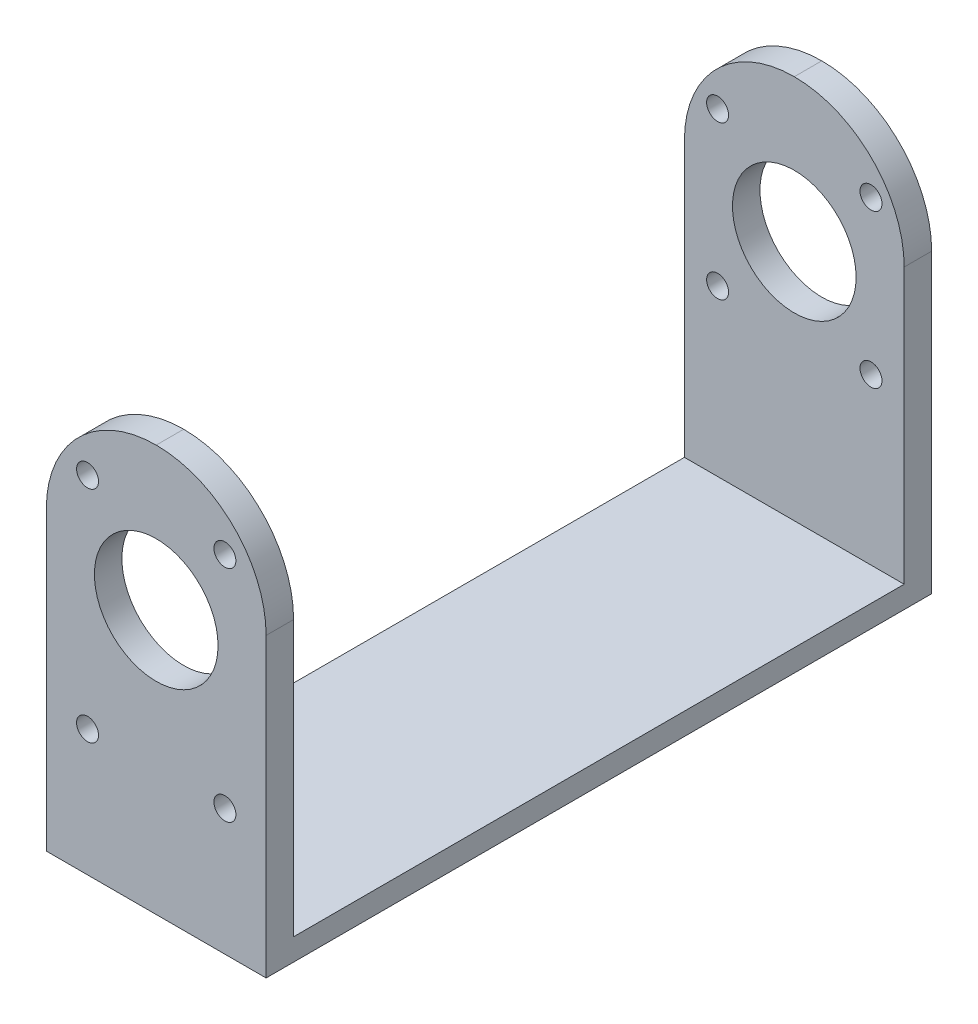
ISO-10303-21;
HEADER;
FILE_DESCRIPTION(('STEP AP214'),'2;1');
FILE_NAME('part.step','',(''),(''),'','','');
FILE_SCHEMA(('AUTOMOTIVE_DESIGN { 1 0 10303 214 1 1 1 1 }'));
ENDSEC;
DATA;
#1=APPLICATION_CONTEXT('core data for automotive mechanical design processes');
#2=APPLICATION_PROTOCOL_DEFINITION('international standard','automotive_design',2000,#1);
#3=PRODUCT_CONTEXT('',#1,'mechanical');
#4=PRODUCT('Part','Part','',(#3));
#5=PRODUCT_RELATED_PRODUCT_CATEGORY('part','',(#4));
#6=PRODUCT_DEFINITION_FORMATION('','',#4);
#7=PRODUCT_DEFINITION_CONTEXT('part definition',#1,'design');
#8=PRODUCT_DEFINITION('design','',#6,#7);
#9=PRODUCT_DEFINITION_SHAPE('','',#8);
#10=(LENGTH_UNIT() NAMED_UNIT(*) SI_UNIT(.MILLI.,.METRE.));
#11=(NAMED_UNIT(*) PLANE_ANGLE_UNIT() SI_UNIT($,.RADIAN.));
#12=(NAMED_UNIT(*) SI_UNIT($,.STERADIAN.) SOLID_ANGLE_UNIT());
#13=UNCERTAINTY_MEASURE_WITH_UNIT(LENGTH_MEASURE(1.E-05),#10,'distance_accuracy_value','');
#14=(GEOMETRIC_REPRESENTATION_CONTEXT(3) GLOBAL_UNCERTAINTY_ASSIGNED_CONTEXT((#13)) GLOBAL_UNIT_ASSIGNED_CONTEXT((#10,
#11,#12)) REPRESENTATION_CONTEXT('',''));
#15=CARTESIAN_POINT('',(0.,0.,0.));
#16=DIRECTION('',(0.,0.,1.));
#17=DIRECTION('',(1.,0.,0.));
#18=AXIS2_PLACEMENT_3D('',#15,#16,#17);
#19=CARTESIAN_POINT('',(0.,5.08,0.));
#20=DIRECTION('',(0.,1.,0.));
#21=DIRECTION('',(0.,0.,1.));
#22=AXIS2_PLACEMENT_3D('',#19,#20,#21);
#23=PLANE('',#22);
#24=DIRECTION('',(0.,0.,-1.));
#25=VECTOR('',#24,1.);
#26=CARTESIAN_POINT('',(0.,5.08,0.));
#27=LINE('',#26,#25);
#28=CARTESIAN_POINT('',(0.,5.08,-6.35));
#29=VERTEX_POINT('',#28);
#30=CARTESIAN_POINT('',(0.,5.08,-147.488618459224));
#31=VERTEX_POINT('',#30);
#32=EDGE_CURVE('E138',#29,#31,#27,.T.);
#33=ORIENTED_EDGE('',*,*,#32,.F.);
#34=DIRECTION('',(-1.,0.,0.));
#35=VECTOR('',#34,1.);
#36=CARTESIAN_POINT('',(0.,5.08,-6.35));
#37=LINE('',#36,#35);
#38=CARTESIAN_POINT('',(50.8,5.08,-6.35));
#39=VERTEX_POINT('',#38);
#40=EDGE_CURVE('E121',#39,#29,#37,.T.);
#41=ORIENTED_EDGE('',*,*,#40,.F.);
#42=DIRECTION('',(0.,0.,-1.));
#43=VECTOR('',#42,1.);
#44=CARTESIAN_POINT('',(50.8,5.08,0.));
#45=LINE('',#44,#43);
#46=CARTESIAN_POINT('',(50.8,5.08,-147.488618459224));
#47=VERTEX_POINT('',#46);
#48=EDGE_CURVE('E130',#39,#47,#45,.T.);
#49=ORIENTED_EDGE('',*,*,#48,.T.);
#50=DIRECTION('',(-1.,0.,0.));
#51=VECTOR('',#50,1.);
#52=CARTESIAN_POINT('',(50.8,5.08,-147.488618459224));
#53=LINE('',#52,#51);
#54=EDGE_CURVE('E126',#47,#31,#53,.T.);
#55=ORIENTED_EDGE('',*,*,#54,.T.);
#56=EDGE_LOOP('',(#33,#41,#49,#55));
#57=FACE_BOUND('',#56,.T.);
#58=ADVANCED_FACE('F39',(#57),#23,.T.);
#59=CARTESIAN_POINT('',(0.,5.08,-153.838618459224));
#60=DIRECTION('',(0.,0.,-1.));
#61=DIRECTION('',(-1.,0.,0.));
#62=AXIS2_PLACEMENT_3D('',#59,#60,#61);
#63=PLANE('',#62);
#64=CARTESIAN_POINT('',(43.1270255829905,43.2329744170095,-153.838618459224));
#65=DIRECTION('',(0.,0.,-1.));
#66=DIRECTION('',(-1.,0.,0.));
#67=AXIS2_PLACEMENT_3D('',#64,#65,#66);
#68=CIRCLE('',#67,2.54);
#69=CARTESIAN_POINT('',(40.5870255829905,43.2329744170095,-153.838618459224));
#70=VERTEX_POINT('',#69);
#71=EDGE_CURVE('E362',#70,#70,#68,.T.);
#72=ORIENTED_EDGE('',*,*,#71,.F.);
#73=EDGE_LOOP('',(#72));
#74=FACE_BOUND('',#73,.T.);
#75=CARTESIAN_POINT('',(7.67297441700949,43.2329744170095,-153.838618459224));
#76=DIRECTION('',(0.,0.,-1.));
#77=DIRECTION('',(-1.,0.,0.));
#78=AXIS2_PLACEMENT_3D('',#75,#76,#77);
#79=CIRCLE('',#78,2.54);
#80=CARTESIAN_POINT('',(5.13297441700949,43.2329744170095,-153.838618459224));
#81=VERTEX_POINT('',#80);
#82=EDGE_CURVE('E368',#81,#81,#79,.T.);
#83=ORIENTED_EDGE('',*,*,#82,.F.);
#84=EDGE_LOOP('',(#83));
#85=FACE_BOUND('',#84,.T.);
#86=CARTESIAN_POINT('',(7.67297441700949,78.6870255829905,-153.838618459224));
#87=DIRECTION('',(0.,0.,-1.));
#88=DIRECTION('',(-1.,0.,0.));
#89=AXIS2_PLACEMENT_3D('',#86,#87,#88);
#90=CIRCLE('',#89,2.54);
#91=CARTESIAN_POINT('',(5.13297441700949,78.6870255829905,-153.838618459224));
#92=VERTEX_POINT('',#91);
#93=EDGE_CURVE('E374',#92,#92,#90,.T.);
#94=ORIENTED_EDGE('',*,*,#93,.F.);
#95=EDGE_LOOP('',(#94));
#96=FACE_BOUND('',#95,.T.);
#97=CARTESIAN_POINT('',(43.1270255829905,78.6870255829905,-153.838618459224));
#98=DIRECTION('',(0.,0.,-1.));
#99=DIRECTION('',(-1.,0.,0.));
#100=AXIS2_PLACEMENT_3D('',#97,#98,#99);
#101=CIRCLE('',#100,2.54);
#102=CARTESIAN_POINT('',(40.5870255829905,78.6870255829905,-153.838618459224));
#103=VERTEX_POINT('',#102);
#104=EDGE_CURVE('E356',#103,#103,#101,.T.);
#105=ORIENTED_EDGE('',*,*,#104,.F.);
#106=EDGE_LOOP('',(#105));
#107=FACE_BOUND('',#106,.T.);
#108=CARTESIAN_POINT('',(25.4,60.96,-153.838618459224));
#109=DIRECTION('',(0.,0.,1.));
#110=DIRECTION('',(1.,0.,0.));
#111=AXIS2_PLACEMENT_3D('',#108,#109,#110);
#112=CIRCLE('',#111,14.2875);
#113=CARTESIAN_POINT('',(39.6875,60.96,-153.838618459224));
#114=VERTEX_POINT('',#113);
#115=EDGE_CURVE('E194',#114,#114,#112,.T.);
#116=ORIENTED_EDGE('',*,*,#115,.T.);
#117=EDGE_LOOP('',(#116));
#118=FACE_BOUND('',#117,.T.);
#119=CARTESIAN_POINT('',(25.4,68.58,-153.838618459224));
#120=DIRECTION('',(0.,0.,-1.));
#121=DIRECTION('',(-1.,0.,0.));
#122=AXIS2_PLACEMENT_3D('',#119,#120,#121);
#123=CIRCLE('',#122,25.4);
#124=CARTESIAN_POINT('',(0.,68.58,-153.838618459224));
#125=VERTEX_POINT('',#124);
#126=CARTESIAN_POINT('',(25.4,93.98,-153.838618459224));
#127=VERTEX_POINT('',#126);
#128=EDGE_CURVE('E224',#125,#127,#123,.T.);
#129=ORIENTED_EDGE('',*,*,#128,.T.);
#130=CARTESIAN_POINT('',(25.4,68.58,-153.838618459224));
#131=DIRECTION('',(0.,0.,-1.));
#132=DIRECTION('',(-1.,0.,0.));
#133=AXIS2_PLACEMENT_3D('',#130,#131,#132);
#134=CIRCLE('',#133,25.4);
#135=CARTESIAN_POINT('',(50.8,68.58,-153.838618459224));
#136=VERTEX_POINT('',#135);
#137=EDGE_CURVE('E11',#127,#136,#134,.T.);
#138=ORIENTED_EDGE('',*,*,#137,.T.);
#139=DIRECTION('',(0.,-1.,0.));
#140=VECTOR('',#139,1.);
#141=CARTESIAN_POINT('',(50.8,5.08,-153.838618459224));
#142=LINE('',#141,#140);
#143=CARTESIAN_POINT('',(50.8,0.,-153.838618459224));
#144=VERTEX_POINT('',#143);
#145=EDGE_CURVE('E164',#136,#144,#142,.T.);
#146=ORIENTED_EDGE('',*,*,#145,.T.);
#147=DIRECTION('',(1.,0.,0.));
#148=VECTOR('',#147,1.);
#149=CARTESIAN_POINT('',(0.,0.,-153.838618459224));
#150=LINE('',#149,#148);
#151=CARTESIAN_POINT('',(0.,0.,-153.838618459224));
#152=VERTEX_POINT('',#151);
#153=EDGE_CURVE('E159',#152,#144,#150,.T.);
#154=ORIENTED_EDGE('',*,*,#153,.F.);
#155=DIRECTION('',(0.,-1.,0.));
#156=VECTOR('',#155,1.);
#157=CARTESIAN_POINT('',(0.,5.08,-153.838618459224));
#158=LINE('',#157,#156);
#159=EDGE_CURVE('E179',#125,#152,#158,.T.);
#160=ORIENTED_EDGE('',*,*,#159,.F.);
#161=EDGE_LOOP('',(#129,#138,#146,#154,#160));
#162=FACE_BOUND('',#161,.T.);
#163=ADVANCED_FACE('F241',(#74,#85,#96,#107,#118,#162),#63,.T.);
#164=CARTESIAN_POINT('',(0.,5.08,0.));
#165=DIRECTION('',(-1.,0.,0.));
#166=DIRECTION('',(0.,0.,1.));
#167=AXIS2_PLACEMENT_3D('',#164,#165,#166);
#168=PLANE('',#167);
#169=DIRECTION('',(0.,-1.,0.));
#170=VECTOR('',#169,1.);
#171=CARTESIAN_POINT('',(0.,93.98,-147.488618459224));
#172=LINE('',#171,#170);
#173=CARTESIAN_POINT('',(0.,68.58,-147.488618459224));
#174=VERTEX_POINT('',#173);
#175=EDGE_CURVE('E156',#174,#31,#172,.T.);
#176=ORIENTED_EDGE('',*,*,#175,.F.);
#177=DIRECTION('',(0.,0.,1.));
#178=VECTOR('',#177,1.);
#179=CARTESIAN_POINT('',(0.,68.58,0.));
#180=LINE('',#179,#178);
#181=EDGE_CURVE('E221',#174,#125,#180,.F.);
#182=ORIENTED_EDGE('',*,*,#181,.T.);
#183=ORIENTED_EDGE('',*,*,#159,.T.);
#184=DIRECTION('',(0.,0.,-1.));
#185=VECTOR('',#184,1.);
#186=CARTESIAN_POINT('',(0.,0.,0.));
#187=LINE('',#186,#185);
#188=CARTESIAN_POINT('',(0.,0.,0.));
#189=VERTEX_POINT('',#188);
#190=EDGE_CURVE('E139',#189,#152,#187,.T.);
#191=ORIENTED_EDGE('',*,*,#190,.F.);
#192=DIRECTION('',(0.,-1.,0.));
#193=VECTOR('',#192,1.);
#194=CARTESIAN_POINT('',(0.,5.08,0.));
#195=LINE('',#194,#193);
#196=CARTESIAN_POINT('',(0.,68.58,0.));
#197=VERTEX_POINT('',#196);
#198=EDGE_CURVE('E183',#197,#189,#195,.T.);
#199=ORIENTED_EDGE('',*,*,#198,.F.);
#200=DIRECTION('',(0.,0.,1.));
#201=VECTOR('',#200,1.);
#202=CARTESIAN_POINT('',(0.,68.58,-6.35));
#203=LINE('',#202,#201);
#204=CARTESIAN_POINT('',(0.,68.58,-6.35));
#205=VERTEX_POINT('',#204);
#206=EDGE_CURVE('E201',#197,#205,#203,.F.);
#207=ORIENTED_EDGE('',*,*,#206,.T.);
#208=DIRECTION('',(0.,-1.,0.));
#209=VECTOR('',#208,1.);
#210=CARTESIAN_POINT('',(0.,93.98,-6.35));
#211=LINE('',#210,#209);
#212=EDGE_CURVE('E127',#205,#29,#211,.T.);
#213=ORIENTED_EDGE('',*,*,#212,.T.);
#214=ORIENTED_EDGE('',*,*,#32,.T.);
#215=EDGE_LOOP('',(#176,#182,#183,#191,#199,#207,#213,#214));
#216=FACE_BOUND('',#215,.T.);
#217=ADVANCED_FACE('F249',(#216),#168,.T.);
#218=CARTESIAN_POINT('',(0.,5.08,0.));
#219=DIRECTION('',(0.,0.,-1.));
#220=DIRECTION('',(-1.,0.,0.));
#221=AXIS2_PLACEMENT_3D('',#218,#219,#220);
#222=PLANE('',#221);
#223=CARTESIAN_POINT('',(41.275,29.21,0.));
#224=DIRECTION('',(0.,0.,-1.));
#225=DIRECTION('',(-1.,0.,0.));
#226=AXIS2_PLACEMENT_3D('',#223,#224,#225);
#227=CIRCLE('',#226,2.54);
#228=CARTESIAN_POINT('',(38.735,29.21,0.));
#229=VERTEX_POINT('',#228);
#230=EDGE_CURVE('E338',#229,#229,#227,.T.);
#231=ORIENTED_EDGE('',*,*,#230,.T.);
#232=EDGE_LOOP('',(#231));
#233=FACE_BOUND('',#232,.T.);
#234=CARTESIAN_POINT('',(9.525,29.21,0.));
#235=DIRECTION('',(0.,0.,-1.));
#236=DIRECTION('',(-1.,0.,0.));
#237=AXIS2_PLACEMENT_3D('',#234,#235,#236);
#238=CIRCLE('',#237,2.54);
#239=CARTESIAN_POINT('',(6.985,29.21,0.));
#240=VERTEX_POINT('',#239);
#241=EDGE_CURVE('E345',#240,#240,#238,.T.);
#242=ORIENTED_EDGE('',*,*,#241,.T.);
#243=EDGE_LOOP('',(#242));
#244=FACE_BOUND('',#243,.T.);
#245=CARTESIAN_POINT('',(9.525,80.01,0.));
#246=DIRECTION('',(0.,0.,-1.));
#247=DIRECTION('',(-1.,0.,0.));
#248=AXIS2_PLACEMENT_3D('',#245,#246,#247);
#249=CIRCLE('',#248,2.54);
#250=CARTESIAN_POINT('',(6.985,80.01,0.));
#251=VERTEX_POINT('',#250);
#252=EDGE_CURVE('E330',#251,#251,#249,.T.);
#253=ORIENTED_EDGE('',*,*,#252,.T.);
#254=EDGE_LOOP('',(#253));
#255=FACE_BOUND('',#254,.T.);
#256=CARTESIAN_POINT('',(41.275,80.01,0.));
#257=DIRECTION('',(0.,0.,-1.));
#258=DIRECTION('',(-1.,0.,0.));
#259=AXIS2_PLACEMENT_3D('',#256,#257,#258);
#260=CIRCLE('',#259,2.54);
#261=CARTESIAN_POINT('',(38.735,80.01,0.));
#262=VERTEX_POINT('',#261);
#263=EDGE_CURVE('E324',#262,#262,#260,.T.);
#264=ORIENTED_EDGE('',*,*,#263,.T.);
#265=EDGE_LOOP('',(#264));
#266=FACE_BOUND('',#265,.T.);
#267=CARTESIAN_POINT('',(25.4,60.96,0.));
#268=DIRECTION('',(0.,0.,1.));
#269=DIRECTION('',(1.,0.,0.));
#270=AXIS2_PLACEMENT_3D('',#267,#268,#269);
#271=CIRCLE('',#270,14.2875);
#272=CARTESIAN_POINT('',(39.6875,60.96,0.));
#273=VERTEX_POINT('',#272);
#274=EDGE_CURVE('E320',#273,#273,#271,.T.);
#275=ORIENTED_EDGE('',*,*,#274,.F.);
#276=EDGE_LOOP('',(#275));
#277=FACE_BOUND('',#276,.T.);
#278=DIRECTION('',(0.,-1.,0.));
#279=VECTOR('',#278,1.);
#280=CARTESIAN_POINT('',(50.8,5.08,0.));
#281=LINE('',#280,#279);
#282=CARTESIAN_POINT('',(50.8,68.58,0.));
#283=VERTEX_POINT('',#282);
#284=CARTESIAN_POINT('',(50.8,0.,0.));
#285=VERTEX_POINT('',#284);
#286=EDGE_CURVE('E186',#283,#285,#281,.T.);
#287=ORIENTED_EDGE('',*,*,#286,.F.);
#288=CARTESIAN_POINT('',(25.4,68.58,0.));
#289=DIRECTION('',(0.,0.,-1.));
#290=DIRECTION('',(-1.,0.,0.));
#291=AXIS2_PLACEMENT_3D('',#288,#289,#290);
#292=CIRCLE('',#291,25.4);
#293=CARTESIAN_POINT('',(25.4,93.98,0.));
#294=VERTEX_POINT('',#293);
#295=EDGE_CURVE('E212',#283,#294,#292,.F.);
#296=ORIENTED_EDGE('',*,*,#295,.T.);
#297=CARTESIAN_POINT('',(25.4,68.58,0.));
#298=DIRECTION('',(0.,0.,-1.));
#299=DIRECTION('',(-1.,0.,0.));
#300=AXIS2_PLACEMENT_3D('',#297,#298,#299);
#301=CIRCLE('',#300,25.4);
#302=EDGE_CURVE('E198',#294,#197,#301,.F.);
#303=ORIENTED_EDGE('',*,*,#302,.T.);
#304=ORIENTED_EDGE('',*,*,#198,.T.);
#305=DIRECTION('',(1.,0.,0.));
#306=VECTOR('',#305,1.);
#307=CARTESIAN_POINT('',(0.,0.,0.));
#308=LINE('',#307,#306);
#309=EDGE_CURVE('E172',#189,#285,#308,.T.);
#310=ORIENTED_EDGE('',*,*,#309,.T.);
#311=EDGE_LOOP('',(#287,#296,#303,#304,#310));
#312=FACE_BOUND('',#311,.T.);
#313=ADVANCED_FACE('F261',(#233,#244,#255,#266,#277,#312),#222,.F.);
#314=CARTESIAN_POINT('',(50.8,5.08,0.));
#315=DIRECTION('',(-1.,0.,0.));
#316=DIRECTION('',(0.,0.,1.));
#317=AXIS2_PLACEMENT_3D('',#314,#315,#316);
#318=PLANE('',#317);
#319=ORIENTED_EDGE('',*,*,#145,.F.);
#320=DIRECTION('',(0.,0.,1.));
#321=VECTOR('',#320,1.);
#322=CARTESIAN_POINT('',(50.8,68.58,-147.488618459224));
#323=LINE('',#322,#321);
#324=CARTESIAN_POINT('',(50.8,68.58,-147.488618459224));
#325=VERTEX_POINT('',#324);
#326=EDGE_CURVE('E227',#136,#325,#323,.T.);
#327=ORIENTED_EDGE('',*,*,#326,.T.);
#328=DIRECTION('',(0.,-1.,0.));
#329=VECTOR('',#328,1.);
#330=CARTESIAN_POINT('',(50.8,93.98,-147.488618459224));
#331=LINE('',#330,#329);
#332=EDGE_CURVE('E133',#325,#47,#331,.T.);
#333=ORIENTED_EDGE('',*,*,#332,.T.);
#334=ORIENTED_EDGE('',*,*,#48,.F.);
#335=DIRECTION('',(0.,-1.,0.));
#336=VECTOR('',#335,1.);
#337=CARTESIAN_POINT('',(50.8,93.98,-6.35));
#338=LINE('',#337,#336);
#339=CARTESIAN_POINT('',(50.8,68.58,-6.35));
#340=VERTEX_POINT('',#339);
#341=EDGE_CURVE('E115',#340,#39,#338,.T.);
#342=ORIENTED_EDGE('',*,*,#341,.F.);
#343=DIRECTION('',(0.,0.,-1.));
#344=VECTOR('',#343,1.);
#345=CARTESIAN_POINT('',(50.8,68.58,0.));
#346=LINE('',#345,#344);
#347=EDGE_CURVE('E209',#340,#283,#346,.F.);
#348=ORIENTED_EDGE('',*,*,#347,.T.);
#349=ORIENTED_EDGE('',*,*,#286,.T.);
#350=DIRECTION('',(0.,0.,-1.));
#351=VECTOR('',#350,1.);
#352=CARTESIAN_POINT('',(50.8,0.,0.));
#353=LINE('',#352,#351);
#354=EDGE_CURVE('E168',#285,#144,#353,.T.);
#355=ORIENTED_EDGE('',*,*,#354,.T.);
#356=EDGE_LOOP('',(#319,#327,#333,#334,#342,#348,#349,#355));
#357=FACE_BOUND('',#356,.T.);
#358=ADVANCED_FACE('F131',(#357),#318,.F.);
#359=CARTESIAN_POINT('',(0.,0.,0.));
#360=DIRECTION('',(0.,1.,0.));
#361=DIRECTION('',(0.,0.,1.));
#362=AXIS2_PLACEMENT_3D('',#359,#360,#361);
#363=PLANE('',#362);
#364=ORIENTED_EDGE('',*,*,#153,.T.);
#365=ORIENTED_EDGE('',*,*,#354,.F.);
#366=ORIENTED_EDGE('',*,*,#309,.F.);
#367=ORIENTED_EDGE('',*,*,#190,.T.);
#368=EDGE_LOOP('',(#364,#365,#366,#367));
#369=FACE_BOUND('',#368,.T.);
#370=ADVANCED_FACE('F246',(#369),#363,.F.);
#371=CARTESIAN_POINT('',(50.8,93.98,-147.488618459224));
#372=DIRECTION('',(0.,0.,1.));
#373=DIRECTION('',(1.,0.,0.));
#374=AXIS2_PLACEMENT_3D('',#371,#372,#373);
#375=PLANE('',#374);
#376=CARTESIAN_POINT('',(43.1270255829905,43.2329744170095,-147.488618459224));
#377=DIRECTION('',(0.,0.,-1.));
#378=DIRECTION('',(-1.,0.,0.));
#379=AXIS2_PLACEMENT_3D('',#376,#377,#378);
#380=CIRCLE('',#379,2.54);
#381=CARTESIAN_POINT('',(40.5870255829905,43.2329744170095,-147.488618459224));
#382=VERTEX_POINT('',#381);
#383=EDGE_CURVE('E296',#382,#382,#380,.T.);
#384=ORIENTED_EDGE('',*,*,#383,.T.);
#385=EDGE_LOOP('',(#384));
#386=FACE_BOUND('',#385,.T.);
#387=CARTESIAN_POINT('',(7.67297441700949,43.2329744170095,-147.488618459224));
#388=DIRECTION('',(0.,0.,-1.));
#389=DIRECTION('',(-1.,0.,0.));
#390=AXIS2_PLACEMENT_3D('',#387,#388,#389);
#391=CIRCLE('',#390,2.54);
#392=CARTESIAN_POINT('',(5.13297441700949,43.2329744170095,-147.488618459224));
#393=VERTEX_POINT('',#392);
#394=EDGE_CURVE('E300',#393,#393,#391,.T.);
#395=ORIENTED_EDGE('',*,*,#394,.T.);
#396=EDGE_LOOP('',(#395));
#397=FACE_BOUND('',#396,.T.);
#398=CARTESIAN_POINT('',(7.67297441700949,78.6870255829905,-147.488618459224));
#399=DIRECTION('',(0.,0.,-1.));
#400=DIRECTION('',(-1.,0.,0.));
#401=AXIS2_PLACEMENT_3D('',#398,#399,#400);
#402=CIRCLE('',#401,2.54);
#403=CARTESIAN_POINT('',(5.13297441700949,78.6870255829905,-147.488618459224));
#404=VERTEX_POINT('',#403);
#405=EDGE_CURVE('E304',#404,#404,#402,.T.);
#406=ORIENTED_EDGE('',*,*,#405,.T.);
#407=EDGE_LOOP('',(#406));
#408=FACE_BOUND('',#407,.T.);
#409=CARTESIAN_POINT('',(43.1270255829905,78.6870255829905,-147.488618459224));
#410=DIRECTION('',(0.,0.,-1.));
#411=DIRECTION('',(-1.,0.,0.));
#412=AXIS2_PLACEMENT_3D('',#409,#410,#411);
#413=CIRCLE('',#412,2.54);
#414=CARTESIAN_POINT('',(40.5870255829905,78.6870255829905,-147.488618459224));
#415=VERTEX_POINT('',#414);
#416=EDGE_CURVE('E308',#415,#415,#413,.T.);
#417=ORIENTED_EDGE('',*,*,#416,.T.);
#418=EDGE_LOOP('',(#417));
#419=FACE_BOUND('',#418,.T.);
#420=CARTESIAN_POINT('',(25.4,60.96,-147.488618459224));
#421=DIRECTION('',(0.,0.,1.));
#422=DIRECTION('',(1.,0.,0.));
#423=AXIS2_PLACEMENT_3D('',#420,#421,#422);
#424=CIRCLE('',#423,14.2875);
#425=CARTESIAN_POINT('',(39.6875,60.96,-147.488618459224));
#426=VERTEX_POINT('',#425);
#427=EDGE_CURVE('E144',#426,#426,#424,.T.);
#428=ORIENTED_EDGE('',*,*,#427,.F.);
#429=EDGE_LOOP('',(#428));
#430=FACE_BOUND('',#429,.T.);
#431=ORIENTED_EDGE('',*,*,#332,.F.);
#432=CARTESIAN_POINT('',(25.4,68.58,-147.488618459224));
#433=DIRECTION('',(0.,0.,1.));
#434=DIRECTION('',(1.,0.,0.));
#435=AXIS2_PLACEMENT_3D('',#432,#433,#434);
#436=CIRCLE('',#435,25.4);
#437=CARTESIAN_POINT('',(25.4,93.98,-147.488618459224));
#438=VERTEX_POINT('',#437);
#439=EDGE_CURVE('E48',#325,#438,#436,.T.);
#440=ORIENTED_EDGE('',*,*,#439,.T.);
#441=CARTESIAN_POINT('',(25.4,68.58,-147.488618459224));
#442=DIRECTION('',(0.,0.,1.));
#443=DIRECTION('',(1.,0.,0.));
#444=AXIS2_PLACEMENT_3D('',#441,#442,#443);
#445=CIRCLE('',#444,25.4);
#446=EDGE_CURVE('E218',#438,#174,#445,.T.);
#447=ORIENTED_EDGE('',*,*,#446,.T.);
#448=ORIENTED_EDGE('',*,*,#175,.T.);
#449=ORIENTED_EDGE('',*,*,#54,.F.);
#450=EDGE_LOOP('',(#431,#440,#447,#448,#449));
#451=FACE_BOUND('',#450,.T.);
#452=ADVANCED_FACE('F232',(#386,#397,#408,#419,#430,#451),#375,.T.);
#453=CARTESIAN_POINT('',(0.,93.98,-6.35));
#454=DIRECTION('',(0.,0.,1.));
#455=DIRECTION('',(1.,0.,0.));
#456=AXIS2_PLACEMENT_3D('',#453,#454,#455);
#457=PLANE('',#456);
#458=CARTESIAN_POINT('',(41.275,29.21,-6.35));
#459=DIRECTION('',(0.,0.,-1.));
#460=DIRECTION('',(-1.,0.,0.));
#461=AXIS2_PLACEMENT_3D('',#458,#459,#460);
#462=CIRCLE('',#461,2.54);
#463=CARTESIAN_POINT('',(38.735,29.21,-6.35));
#464=VERTEX_POINT('',#463);
#465=EDGE_CURVE('E334',#464,#464,#462,.T.);
#466=ORIENTED_EDGE('',*,*,#465,.F.);
#467=EDGE_LOOP('',(#466));
#468=FACE_BOUND('',#467,.T.);
#469=CARTESIAN_POINT('',(9.525,29.21,-6.35));
#470=DIRECTION('',(0.,0.,-1.));
#471=DIRECTION('',(-1.,0.,0.));
#472=AXIS2_PLACEMENT_3D('',#469,#470,#471);
#473=CIRCLE('',#472,2.54);
#474=CARTESIAN_POINT('',(6.985,29.21,-6.35));
#475=VERTEX_POINT('',#474);
#476=EDGE_CURVE('E341',#475,#475,#473,.T.);
#477=ORIENTED_EDGE('',*,*,#476,.F.);
#478=EDGE_LOOP('',(#477));
#479=FACE_BOUND('',#478,.T.);
#480=CARTESIAN_POINT('',(9.525,80.01,-6.35));
#481=DIRECTION('',(0.,0.,-1.));
#482=DIRECTION('',(-1.,0.,0.));
#483=AXIS2_PLACEMENT_3D('',#480,#481,#482);
#484=CIRCLE('',#483,2.54);
#485=CARTESIAN_POINT('',(6.985,80.01,-6.35));
#486=VERTEX_POINT('',#485);
#487=EDGE_CURVE('E349',#486,#486,#484,.T.);
#488=ORIENTED_EDGE('',*,*,#487,.F.);
#489=EDGE_LOOP('',(#488));
#490=FACE_BOUND('',#489,.T.);
#491=CARTESIAN_POINT('',(41.275,80.01,-6.35));
#492=DIRECTION('',(0.,0.,-1.));
#493=DIRECTION('',(-1.,0.,0.));
#494=AXIS2_PLACEMENT_3D('',#491,#492,#493);
#495=CIRCLE('',#494,2.54);
#496=CARTESIAN_POINT('',(38.735,80.01,-6.35));
#497=VERTEX_POINT('',#496);
#498=EDGE_CURVE('E326',#497,#497,#495,.T.);
#499=ORIENTED_EDGE('',*,*,#498,.F.);
#500=EDGE_LOOP('',(#499));
#501=FACE_BOUND('',#500,.T.);
#502=CARTESIAN_POINT('',(25.4,60.96,-6.34999999999999));
#503=DIRECTION('',(0.,0.,1.));
#504=DIRECTION('',(1.,0.,0.));
#505=AXIS2_PLACEMENT_3D('',#502,#503,#504);
#506=CIRCLE('',#505,14.2875);
#507=CARTESIAN_POINT('',(39.6875,60.96,-6.34999999999999));
#508=VERTEX_POINT('',#507);
#509=EDGE_CURVE('E150',#508,#508,#506,.T.);
#510=ORIENTED_EDGE('',*,*,#509,.T.);
#511=EDGE_LOOP('',(#510));
#512=FACE_BOUND('',#511,.T.);
#513=CARTESIAN_POINT('',(25.4,68.58,-6.35));
#514=DIRECTION('',(0.,0.,1.));
#515=DIRECTION('',(1.,0.,0.));
#516=AXIS2_PLACEMENT_3D('',#513,#514,#515);
#517=CIRCLE('',#516,25.4);
#518=CARTESIAN_POINT('',(25.4,93.98,-6.35));
#519=VERTEX_POINT('',#518);
#520=EDGE_CURVE('E204',#205,#519,#517,.F.);
#521=ORIENTED_EDGE('',*,*,#520,.T.);
#522=CARTESIAN_POINT('',(25.4,68.58,-6.35));
#523=DIRECTION('',(0.,0.,1.));
#524=DIRECTION('',(1.,0.,0.));
#525=AXIS2_PLACEMENT_3D('',#522,#523,#524);
#526=CIRCLE('',#525,25.4);
#527=EDGE_CURVE('E122',#519,#340,#526,.F.);
#528=ORIENTED_EDGE('',*,*,#527,.T.);
#529=ORIENTED_EDGE('',*,*,#341,.T.);
#530=ORIENTED_EDGE('',*,*,#40,.T.);
#531=ORIENTED_EDGE('',*,*,#212,.F.);
#532=EDGE_LOOP('',(#521,#528,#529,#530,#531));
#533=FACE_BOUND('',#532,.T.);
#534=ADVANCED_FACE('F118',(#468,#479,#490,#501,#512,#533),#457,.F.);
#535=CARTESIAN_POINT('',(25.4,60.96,-153.838618459224));
#536=DIRECTION('',(0.,0.,1.));
#537=DIRECTION('',(1.,0.,0.));
#538=AXIS2_PLACEMENT_3D('',#535,#536,#537);
#539=CYLINDRICAL_SURFACE('',#538,14.2875);
#540=ORIENTED_EDGE('',*,*,#274,.T.);
#541=EDGE_LOOP('',(#540));
#542=FACE_BOUND('',#541,.T.);
#543=ORIENTED_EDGE('',*,*,#509,.F.);
#544=EDGE_LOOP('',(#543));
#545=FACE_BOUND('',#544,.T.);
#546=ADVANCED_FACE('F291',(#542,#545),#539,.F.);
#547=ORIENTED_EDGE('',*,*,#427,.T.);
#548=EDGE_LOOP('',(#547));
#549=FACE_BOUND('',#548,.T.);
#550=ORIENTED_EDGE('',*,*,#115,.F.);
#551=EDGE_LOOP('',(#550));
#552=FACE_BOUND('',#551,.T.);
#553=ADVANCED_FACE('F311',(#549,#552),#539,.F.);
#554=CARTESIAN_POINT('',(41.275,80.01,0.));
#555=DIRECTION('',(0.,0.,-1.));
#556=DIRECTION('',(-1.,0.,0.));
#557=AXIS2_PLACEMENT_3D('',#554,#555,#556);
#558=CYLINDRICAL_SURFACE('',#557,2.54);
#559=ORIENTED_EDGE('',*,*,#263,.F.);
#560=EDGE_LOOP('',(#559));
#561=FACE_BOUND('',#560,.T.);
#562=ORIENTED_EDGE('',*,*,#498,.T.);
#563=EDGE_LOOP('',(#562));
#564=FACE_BOUND('',#563,.T.);
#565=ADVANCED_FACE('F314',(#561,#564),#558,.F.);
#566=CARTESIAN_POINT('',(9.525,80.01,0.));
#567=DIRECTION('',(0.,0.,-1.));
#568=DIRECTION('',(-1.,0.,0.));
#569=AXIS2_PLACEMENT_3D('',#566,#567,#568);
#570=CYLINDRICAL_SURFACE('',#569,2.54);
#571=ORIENTED_EDGE('',*,*,#252,.F.);
#572=EDGE_LOOP('',(#571));
#573=FACE_BOUND('',#572,.T.);
#574=ORIENTED_EDGE('',*,*,#487,.T.);
#575=EDGE_LOOP('',(#574));
#576=FACE_BOUND('',#575,.T.);
#577=ADVANCED_FACE('F405',(#573,#576),#570,.F.);
#578=CARTESIAN_POINT('',(9.525,29.21,0.));
#579=DIRECTION('',(0.,0.,-1.));
#580=DIRECTION('',(-1.,0.,0.));
#581=AXIS2_PLACEMENT_3D('',#578,#579,#580);
#582=CYLINDRICAL_SURFACE('',#581,2.54);
#583=ORIENTED_EDGE('',*,*,#241,.F.);
#584=EDGE_LOOP('',(#583));
#585=FACE_BOUND('',#584,.T.);
#586=ORIENTED_EDGE('',*,*,#476,.T.);
#587=EDGE_LOOP('',(#586));
#588=FACE_BOUND('',#587,.T.);
#589=ADVANCED_FACE('F398',(#585,#588),#582,.F.);
#590=CARTESIAN_POINT('',(41.275,29.21,0.));
#591=DIRECTION('',(0.,0.,-1.));
#592=DIRECTION('',(-1.,0.,0.));
#593=AXIS2_PLACEMENT_3D('',#590,#591,#592);
#594=CYLINDRICAL_SURFACE('',#593,2.54);
#595=ORIENTED_EDGE('',*,*,#230,.F.);
#596=EDGE_LOOP('',(#595));
#597=FACE_BOUND('',#596,.T.);
#598=ORIENTED_EDGE('',*,*,#465,.T.);
#599=EDGE_LOOP('',(#598));
#600=FACE_BOUND('',#599,.T.);
#601=ADVANCED_FACE('F388',(#597,#600),#594,.F.);
#602=CARTESIAN_POINT('',(43.1270255829905,78.6870255829905,-147.488618459224));
#603=DIRECTION('',(0.,0.,-1.));
#604=DIRECTION('',(-1.,0.,0.));
#605=AXIS2_PLACEMENT_3D('',#602,#603,#604);
#606=CYLINDRICAL_SURFACE('',#605,2.54);
#607=ORIENTED_EDGE('',*,*,#416,.F.);
#608=EDGE_LOOP('',(#607));
#609=FACE_BOUND('',#608,.T.);
#610=ORIENTED_EDGE('',*,*,#104,.T.);
#611=EDGE_LOOP('',(#610));
#612=FACE_BOUND('',#611,.T.);
#613=ADVANCED_FACE('F386',(#609,#612),#606,.F.);
#614=CARTESIAN_POINT('',(7.67297441700949,78.6870255829905,-147.488618459224));
#615=DIRECTION('',(0.,0.,-1.));
#616=DIRECTION('',(-1.,0.,0.));
#617=AXIS2_PLACEMENT_3D('',#614,#615,#616);
#618=CYLINDRICAL_SURFACE('',#617,2.54);
#619=ORIENTED_EDGE('',*,*,#405,.F.);
#620=EDGE_LOOP('',(#619));
#621=FACE_BOUND('',#620,.T.);
#622=ORIENTED_EDGE('',*,*,#93,.T.);
#623=EDGE_LOOP('',(#622));
#624=FACE_BOUND('',#623,.T.);
#625=ADVANCED_FACE('F381',(#621,#624),#618,.F.);
#626=CARTESIAN_POINT('',(7.67297441700949,43.2329744170095,-147.488618459224));
#627=DIRECTION('',(0.,0.,-1.));
#628=DIRECTION('',(-1.,0.,0.));
#629=AXIS2_PLACEMENT_3D('',#626,#627,#628);
#630=CYLINDRICAL_SURFACE('',#629,2.54);
#631=ORIENTED_EDGE('',*,*,#394,.F.);
#632=EDGE_LOOP('',(#631));
#633=FACE_BOUND('',#632,.T.);
#634=ORIENTED_EDGE('',*,*,#82,.T.);
#635=EDGE_LOOP('',(#634));
#636=FACE_BOUND('',#635,.T.);
#637=ADVANCED_FACE('F395',(#633,#636),#630,.F.);
#638=CARTESIAN_POINT('',(43.1270255829905,43.2329744170095,-147.488618459224));
#639=DIRECTION('',(0.,0.,-1.));
#640=DIRECTION('',(-1.,0.,0.));
#641=AXIS2_PLACEMENT_3D('',#638,#639,#640);
#642=CYLINDRICAL_SURFACE('',#641,2.54);
#643=ORIENTED_EDGE('',*,*,#383,.F.);
#644=EDGE_LOOP('',(#643));
#645=FACE_BOUND('',#644,.T.);
#646=ORIENTED_EDGE('',*,*,#71,.T.);
#647=EDGE_LOOP('',(#646));
#648=FACE_BOUND('',#647,.T.);
#649=ADVANCED_FACE('F403',(#645,#648),#642,.F.);
#650=CARTESIAN_POINT('',(25.4,68.58,0.));
#651=DIRECTION('',(0.,0.,-1.));
#652=DIRECTION('',(-1.,0.,0.));
#653=AXIS2_PLACEMENT_3D('',#650,#651,#652);
#654=CYLINDRICAL_SURFACE('',#653,25.4);
#655=ORIENTED_EDGE('',*,*,#520,.F.);
#656=ORIENTED_EDGE('',*,*,#206,.F.);
#657=ORIENTED_EDGE('',*,*,#302,.F.);
#658=DIRECTION('',(0.,0.,1.));
#659=VECTOR('',#658,1.);
#660=CARTESIAN_POINT('',(25.4,93.98,0.));
#661=LINE('',#660,#659);
#662=EDGE_CURVE('E182',#519,#294,#661,.T.);
#663=ORIENTED_EDGE('',*,*,#662,.F.);
#664=EDGE_LOOP('',(#655,#656,#657,#663));
#665=FACE_BOUND('',#664,.T.);
#666=ADVANCED_FACE('F254',(#665),#654,.T.);
#667=CARTESIAN_POINT('',(25.4,68.58,0.));
#668=DIRECTION('',(0.,0.,-1.));
#669=DIRECTION('',(-1.,0.,0.));
#670=AXIS2_PLACEMENT_3D('',#667,#668,#669);
#671=CYLINDRICAL_SURFACE('',#670,25.4);
#672=ORIENTED_EDGE('',*,*,#295,.F.);
#673=ORIENTED_EDGE('',*,*,#347,.F.);
#674=ORIENTED_EDGE('',*,*,#527,.F.);
#675=ORIENTED_EDGE('',*,*,#662,.T.);
#676=EDGE_LOOP('',(#672,#673,#674,#675));
#677=FACE_BOUND('',#676,.T.);
#678=ADVANCED_FACE('F258',(#677),#671,.T.);
#679=CARTESIAN_POINT('',(25.4,68.58,0.));
#680=DIRECTION('',(0.,0.,1.));
#681=DIRECTION('',(1.,0.,0.));
#682=AXIS2_PLACEMENT_3D('',#679,#680,#681);
#683=CYLINDRICAL_SURFACE('',#682,25.4);
#684=ORIENTED_EDGE('',*,*,#128,.F.);
#685=ORIENTED_EDGE('',*,*,#181,.F.);
#686=ORIENTED_EDGE('',*,*,#446,.F.);
#687=DIRECTION('',(0.,0.,1.));
#688=VECTOR('',#687,1.);
#689=CARTESIAN_POINT('',(25.4,93.98,0.));
#690=LINE('',#689,#688);
#691=EDGE_CURVE('E215',#127,#438,#690,.T.);
#692=ORIENTED_EDGE('',*,*,#691,.F.);
#693=EDGE_LOOP('',(#684,#685,#686,#692));
#694=FACE_BOUND('',#693,.T.);
#695=ADVANCED_FACE('F238',(#694),#683,.T.);
#696=CARTESIAN_POINT('',(25.4,68.58,0.));
#697=DIRECTION('',(0.,0.,-1.));
#698=DIRECTION('',(-1.,0.,0.));
#699=AXIS2_PLACEMENT_3D('',#696,#697,#698);
#700=CYLINDRICAL_SURFACE('',#699,25.4);
#701=ORIENTED_EDGE('',*,*,#137,.F.);
#702=ORIENTED_EDGE('',*,*,#691,.T.);
#703=ORIENTED_EDGE('',*,*,#439,.F.);
#704=ORIENTED_EDGE('',*,*,#326,.F.);
#705=EDGE_LOOP('',(#701,#702,#703,#704));
#706=FACE_BOUND('',#705,.T.);
#707=ADVANCED_FACE('F41',(#706),#700,.T.);
#708=CLOSED_SHELL('',(#58,#163,#217,#313,#358,#370,#452,#534,#546,#553,#565,#577,#589,#601,#613,
#625,#637,#649,#666,#678,#695,#707));
#709=MANIFOLD_SOLID_BREP('B2',#708);
#710=ADVANCED_BREP_SHAPE_REPRESENTATION('',(#18,#709),#14);
#711=SHAPE_DEFINITION_REPRESENTATION(#9,#710);
ENDSEC;
END-ISO-10303-21;
